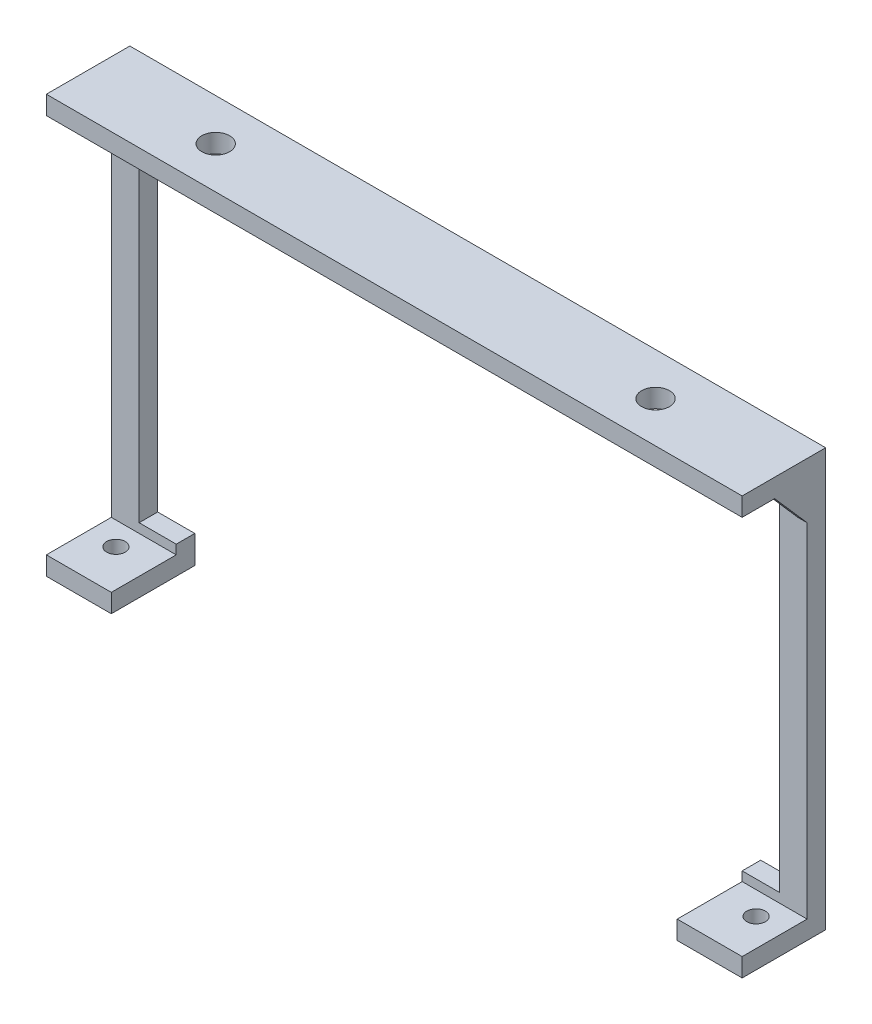
ISO-10303-21;
HEADER;
FILE_DESCRIPTION(('STEP AP214'),'2;1');
FILE_NAME('part.step','',(''),(''),'','','');
FILE_SCHEMA(('AUTOMOTIVE_DESIGN { 1 0 10303 214 1 1 1 1 }'));
ENDSEC;
DATA;
#1=APPLICATION_CONTEXT('core data for automotive mechanical design processes');
#2=APPLICATION_PROTOCOL_DEFINITION('international standard','automotive_design',2000,#1);
#3=PRODUCT_CONTEXT('',#1,'mechanical');
#4=PRODUCT('Part','Part','',(#3));
#5=PRODUCT_RELATED_PRODUCT_CATEGORY('part','',(#4));
#6=PRODUCT_DEFINITION_FORMATION('','',#4);
#7=PRODUCT_DEFINITION_CONTEXT('part definition',#1,'design');
#8=PRODUCT_DEFINITION('design','',#6,#7);
#9=PRODUCT_DEFINITION_SHAPE('','',#8);
#10=(LENGTH_UNIT() NAMED_UNIT(*) SI_UNIT(.MILLI.,.METRE.));
#11=(NAMED_UNIT(*) PLANE_ANGLE_UNIT() SI_UNIT($,.RADIAN.));
#12=(NAMED_UNIT(*) SI_UNIT($,.STERADIAN.) SOLID_ANGLE_UNIT());
#13=UNCERTAINTY_MEASURE_WITH_UNIT(LENGTH_MEASURE(1.E-05),#10,'distance_accuracy_value','');
#14=(GEOMETRIC_REPRESENTATION_CONTEXT(3) GLOBAL_UNCERTAINTY_ASSIGNED_CONTEXT((#13)) GLOBAL_UNIT_ASSIGNED_CONTEXT((#10,
#11,#12)) REPRESENTATION_CONTEXT('',''));
#15=CARTESIAN_POINT('',(0.,0.,0.));
#16=DIRECTION('',(0.,0.,1.));
#17=DIRECTION('',(1.,0.,0.));
#18=AXIS2_PLACEMENT_3D('',#15,#16,#17);
#19=CARTESIAN_POINT('',(68.,0.,2.));
#20=DIRECTION('',(0.,1.,0.));
#21=DIRECTION('',(0.,0.,1.));
#22=AXIS2_PLACEMENT_3D('',#19,#20,#21);
#23=PLANE('',#22);
#24=CARTESIAN_POINT('',(72.,0.,4.5));
#25=DIRECTION('',(0.,-1.,0.));
#26=DIRECTION('',(0.,0.,-1.));
#27=AXIS2_PLACEMENT_3D('',#24,#25,#26);
#28=CIRCLE('',#27,0.999999999999998);
#29=CARTESIAN_POINT('',(72.,0.,3.50000000000001));
#30=VERTEX_POINT('',#29);
#31=EDGE_CURVE('E391',#30,#30,#28,.T.);
#32=ORIENTED_EDGE('',*,*,#31,.F.);
#33=EDGE_LOOP('',(#32));
#34=FACE_BOUND('',#33,.T.);
#35=DIRECTION('',(-1.,0.,0.));
#36=VECTOR('',#35,1.);
#37=CARTESIAN_POINT('',(82.2801098892805,0.,9.));
#38=LINE('',#37,#36);
#39=CARTESIAN_POINT('',(75.,0.,9.));
#40=VERTEX_POINT('',#39);
#41=CARTESIAN_POINT('',(68.,0.,9.00000000000013));
#42=VERTEX_POINT('',#41);
#43=EDGE_CURVE('E201',#40,#42,#38,.T.);
#44=ORIENTED_EDGE('',*,*,#43,.T.);
#45=DIRECTION('',(0.,0.,-1.));
#46=VECTOR('',#45,1.);
#47=CARTESIAN_POINT('',(68.,0.,2.));
#48=LINE('',#47,#46);
#49=CARTESIAN_POINT('',(68.,0.,0.));
#50=VERTEX_POINT('',#49);
#51=EDGE_CURVE('E185',#42,#50,#48,.T.);
#52=ORIENTED_EDGE('',*,*,#51,.T.);
#53=DIRECTION('',(1.,0.,0.));
#54=VECTOR('',#53,1.);
#55=CARTESIAN_POINT('',(68.,0.,0.));
#56=LINE('',#55,#54);
#57=CARTESIAN_POINT('',(75.,0.,0.));
#58=VERTEX_POINT('',#57);
#59=EDGE_CURVE('E297',#50,#58,#56,.T.);
#60=ORIENTED_EDGE('',*,*,#59,.T.);
#61=DIRECTION('',(0.,0.,-1.));
#62=VECTOR('',#61,1.);
#63=CARTESIAN_POINT('',(75.,0.,2.));
#64=LINE('',#63,#62);
#65=EDGE_CURVE('E194',#40,#58,#64,.T.);
#66=ORIENTED_EDGE('',*,*,#65,.F.);
#67=EDGE_LOOP('',(#44,#52,#60,#66));
#68=FACE_BOUND('',#67,.T.);
#69=ADVANCED_FACE('F35',(#34,#68),#23,.F.);
#70=CARTESIAN_POINT('',(82.2801098892805,0.,9.));
#71=DIRECTION('',(0.,0.,-1.));
#72=DIRECTION('',(-1.,0.,0.));
#73=AXIS2_PLACEMENT_3D('',#70,#71,#72);
#74=PLANE('',#73);
#75=DIRECTION('',(-1.,0.,0.));
#76=VECTOR('',#75,1.);
#77=CARTESIAN_POINT('',(82.2801098892805,2.,9.));
#78=LINE('',#77,#76);
#79=CARTESIAN_POINT('',(75.,2.,9.));
#80=VERTEX_POINT('',#79);
#81=CARTESIAN_POINT('',(68.,2.,9.));
#82=VERTEX_POINT('',#81);
#83=EDGE_CURVE('E203',#80,#82,#78,.T.);
#84=ORIENTED_EDGE('',*,*,#83,.T.);
#85=DIRECTION('',(0.,-1.,0.));
#86=VECTOR('',#85,1.);
#87=CARTESIAN_POINT('',(68.,2.00000000000002,9.00000000000012));
#88=LINE('',#87,#86);
#89=EDGE_CURVE('E53',#82,#42,#88,.T.);
#90=ORIENTED_EDGE('',*,*,#89,.T.);
#91=ORIENTED_EDGE('',*,*,#43,.F.);
#92=DIRECTION('',(0.,1.,0.));
#93=VECTOR('',#92,1.);
#94=CARTESIAN_POINT('',(75.,0.,9.));
#95=LINE('',#94,#93);
#96=EDGE_CURVE('E219',#40,#80,#95,.T.);
#97=ORIENTED_EDGE('',*,*,#96,.T.);
#98=EDGE_LOOP('',(#84,#90,#91,#97));
#99=FACE_BOUND('',#98,.T.);
#100=ADVANCED_FACE('F199',(#99),#74,.F.);
#101=CARTESIAN_POINT('',(82.2801098892805,2.,1.99999999999999));
#102=DIRECTION('',(0.,-1.,0.));
#103=DIRECTION('',(0.,0.,-1.));
#104=AXIS2_PLACEMENT_3D('',#101,#102,#103);
#105=PLANE('',#104);
#106=CARTESIAN_POINT('',(72.,2.,4.5));
#107=DIRECTION('',(0.,-1.,0.));
#108=DIRECTION('',(0.,0.,-1.));
#109=AXIS2_PLACEMENT_3D('',#106,#107,#108);
#110=CIRCLE('',#109,0.999999999999998);
#111=CARTESIAN_POINT('',(72.,2.,3.50000000000001));
#112=VERTEX_POINT('',#111);
#113=EDGE_CURVE('E394',#112,#112,#110,.F.);
#114=ORIENTED_EDGE('',*,*,#113,.F.);
#115=EDGE_LOOP('',(#114));
#116=FACE_BOUND('',#115,.T.);
#117=DIRECTION('',(-1.,0.,0.));
#118=VECTOR('',#117,1.);
#119=CARTESIAN_POINT('',(82.2801098892805,2.,1.99999999999999));
#120=LINE('',#119,#118);
#121=CARTESIAN_POINT('',(75.,2.,1.99999999999999));
#122=VERTEX_POINT('',#121);
#123=CARTESIAN_POINT('',(68.,2.,1.99999999999999));
#124=VERTEX_POINT('',#123);
#125=EDGE_CURVE('E216',#122,#124,#120,.T.);
#126=ORIENTED_EDGE('',*,*,#125,.T.);
#127=DIRECTION('',(0.,0.,-1.));
#128=VECTOR('',#127,1.);
#129=CARTESIAN_POINT('',(68.,2.00000000000002,9.00000000000012));
#130=LINE('',#129,#128);
#131=EDGE_CURVE('E397',#82,#124,#130,.T.);
#132=ORIENTED_EDGE('',*,*,#131,.F.);
#133=ORIENTED_EDGE('',*,*,#83,.F.);
#134=DIRECTION('',(0.,0.,-1.));
#135=VECTOR('',#134,1.);
#136=CARTESIAN_POINT('',(75.,2.,1.99999999999999));
#137=LINE('',#136,#135);
#138=EDGE_CURVE('E228',#80,#122,#137,.T.);
#139=ORIENTED_EDGE('',*,*,#138,.T.);
#140=EDGE_LOOP('',(#126,#132,#133,#139));
#141=FACE_BOUND('',#140,.T.);
#142=ADVANCED_FACE('F407',(#116,#141),#105,.F.);
#143=CARTESIAN_POINT('',(0.,45.,2.));
#144=DIRECTION('',(0.,0.,-1.));
#145=DIRECTION('',(-1.,0.,0.));
#146=AXIS2_PLACEMENT_3D('',#143,#144,#145);
#147=PLANE('',#146);
#148=DIRECTION('',(1.,0.,0.));
#149=VECTOR('',#148,1.);
#150=CARTESIAN_POINT('',(74.,39.,2.));
#151=LINE('',#150,#149);
#152=CARTESIAN_POINT('',(74.,39.,2.));
#153=VERTEX_POINT('',#152);
#154=CARTESIAN_POINT('',(75.,39.,2.));
#155=VERTEX_POINT('',#154);
#156=EDGE_CURVE('E61',#153,#155,#151,.T.);
#157=ORIENTED_EDGE('',*,*,#156,.F.);
#158=DIRECTION('',(0.,-1.,0.));
#159=VECTOR('',#158,1.);
#160=CARTESIAN_POINT('',(74.,43.,2.));
#161=LINE('',#160,#159);
#162=CARTESIAN_POINT('',(74.,43.,2.));
#163=VERTEX_POINT('',#162);
#164=EDGE_CURVE('E361',#163,#153,#161,.T.);
#165=ORIENTED_EDGE('',*,*,#164,.F.);
#166=DIRECTION('',(-1.,0.,0.));
#167=VECTOR('',#166,1.);
#168=CARTESIAN_POINT('',(82.2801098892805,43.,2.));
#169=LINE('',#168,#167);
#170=CARTESIAN_POINT('',(1.,43.,2.));
#171=VERTEX_POINT('',#170);
#172=EDGE_CURVE('E233',#163,#171,#169,.T.);
#173=ORIENTED_EDGE('',*,*,#172,.T.);
#174=DIRECTION('',(0.,-1.,0.));
#175=VECTOR('',#174,1.);
#176=CARTESIAN_POINT('',(1.,43.,2.));
#177=LINE('',#176,#175);
#178=CARTESIAN_POINT('',(1.,39.,2.));
#179=VERTEX_POINT('',#178);
#180=EDGE_CURVE('E354',#171,#179,#177,.T.);
#181=ORIENTED_EDGE('',*,*,#180,.T.);
#182=DIRECTION('',(-1.,0.,0.));
#183=VECTOR('',#182,1.);
#184=CARTESIAN_POINT('',(1.,39.,2.));
#185=LINE('',#184,#183);
#186=CARTESIAN_POINT('',(0.,39.,2.));
#187=VERTEX_POINT('',#186);
#188=EDGE_CURVE('E340',#179,#187,#185,.T.);
#189=ORIENTED_EDGE('',*,*,#188,.T.);
#190=DIRECTION('',(0.,-1.,0.));
#191=VECTOR('',#190,1.);
#192=CARTESIAN_POINT('',(0.,0.,2.));
#193=LINE('',#192,#191);
#194=CARTESIAN_POINT('',(0.,2.,1.99999999999999));
#195=VERTEX_POINT('',#194);
#196=EDGE_CURVE('E235',#187,#195,#193,.T.);
#197=ORIENTED_EDGE('',*,*,#196,.T.);
#198=DIRECTION('',(-1.,0.,0.));
#199=VECTOR('',#198,1.);
#200=CARTESIAN_POINT('',(0.,2.,2.));
#201=LINE('',#200,#199);
#202=CARTESIAN_POINT('',(7.,2.,2.));
#203=VERTEX_POINT('',#202);
#204=EDGE_CURVE('E11',#203,#195,#201,.T.);
#205=ORIENTED_EDGE('',*,*,#204,.F.);
#206=DIRECTION('',(0.,1.,0.));
#207=VECTOR('',#206,1.);
#208=CARTESIAN_POINT('',(7.,3.,2.));
#209=LINE('',#208,#207);
#210=CARTESIAN_POINT('',(7.,3.,2.));
#211=VERTEX_POINT('',#210);
#212=EDGE_CURVE('E237',#203,#211,#209,.T.);
#213=ORIENTED_EDGE('',*,*,#212,.T.);
#214=DIRECTION('',(-1.,0.,0.));
#215=VECTOR('',#214,1.);
#216=CARTESIAN_POINT('',(3.,3.,2.));
#217=LINE('',#216,#215);
#218=CARTESIAN_POINT('',(3.,3.,2.));
#219=VERTEX_POINT('',#218);
#220=EDGE_CURVE('E244',#211,#219,#217,.T.);
#221=ORIENTED_EDGE('',*,*,#220,.T.);
#222=DIRECTION('',(0.,1.,0.));
#223=VECTOR('',#222,1.);
#224=CARTESIAN_POINT('',(3.,3.,2.));
#225=LINE('',#224,#223);
#226=CARTESIAN_POINT('',(3.,42.,2.));
#227=VERTEX_POINT('',#226);
#228=EDGE_CURVE('E246',#219,#227,#225,.T.);
#229=ORIENTED_EDGE('',*,*,#228,.T.);
#230=DIRECTION('',(1.,0.,0.));
#231=VECTOR('',#230,1.);
#232=CARTESIAN_POINT('',(3.,42.,2.));
#233=LINE('',#232,#231);
#234=CARTESIAN_POINT('',(72.,42.,2.));
#235=VERTEX_POINT('',#234);
#236=EDGE_CURVE('E248',#227,#235,#233,.T.);
#237=ORIENTED_EDGE('',*,*,#236,.T.);
#238=DIRECTION('',(0.,-1.,0.));
#239=VECTOR('',#238,1.);
#240=CARTESIAN_POINT('',(72.,3.,2.));
#241=LINE('',#240,#239);
#242=CARTESIAN_POINT('',(72.,3.,2.));
#243=VERTEX_POINT('',#242);
#244=EDGE_CURVE('E250',#235,#243,#241,.T.);
#245=ORIENTED_EDGE('',*,*,#244,.T.);
#246=DIRECTION('',(-1.,0.,0.));
#247=VECTOR('',#246,1.);
#248=CARTESIAN_POINT('',(68.,3.,2.));
#249=LINE('',#248,#247);
#250=CARTESIAN_POINT('',(68.,3.,2.));
#251=VERTEX_POINT('',#250);
#252=EDGE_CURVE('E252',#243,#251,#249,.T.);
#253=ORIENTED_EDGE('',*,*,#252,.T.);
#254=DIRECTION('',(0.,-1.,0.));
#255=VECTOR('',#254,1.);
#256=CARTESIAN_POINT('',(68.,3.,2.));
#257=LINE('',#256,#255);
#258=EDGE_CURVE('E254',#251,#124,#257,.T.);
#259=ORIENTED_EDGE('',*,*,#258,.T.);
#260=ORIENTED_EDGE('',*,*,#125,.F.);
#261=DIRECTION('',(0.,1.,0.));
#262=VECTOR('',#261,1.);
#263=CARTESIAN_POINT('',(75.,0.,2.));
#264=LINE('',#263,#262);
#265=EDGE_CURVE('E257',#122,#155,#264,.T.);
#266=ORIENTED_EDGE('',*,*,#265,.T.);
#267=EDGE_LOOP('',(#157,#165,#173,#181,#189,#197,#205,#213,#221,#229,#237,#245,#253,#259,#260,#266));
#268=FACE_BOUND('',#267,.T.);
#269=ADVANCED_FACE('F404',(#268),#147,.F.);
#270=CARTESIAN_POINT('',(82.2801098892805,43.,2.));
#271=DIRECTION('',(0.,1.,0.));
#272=DIRECTION('',(0.,0.,1.));
#273=AXIS2_PLACEMENT_3D('',#270,#271,#272);
#274=PLANE('',#273);
#275=CARTESIAN_POINT('',(61.24995606913,43.,4.58596982128615));
#276=DIRECTION('',(0.,1.,0.));
#277=DIRECTION('',(0.,0.,1.));
#278=AXIS2_PLACEMENT_3D('',#275,#276,#277);
#279=CIRCLE('',#278,1.5);
#280=CARTESIAN_POINT('',(61.24995606913,43.,6.08596982128615));
#281=VERTEX_POINT('',#280);
#282=EDGE_CURVE('E377',#281,#281,#279,.F.);
#283=ORIENTED_EDGE('',*,*,#282,.F.);
#284=EDGE_LOOP('',(#283));
#285=FACE_BOUND('',#284,.T.);
#286=CARTESIAN_POINT('',(13.75004393087,43.,4.4946086830809));
#287=DIRECTION('',(0.,1.,0.));
#288=DIRECTION('',(0.,0.,1.));
#289=AXIS2_PLACEMENT_3D('',#286,#287,#288);
#290=CIRCLE('',#289,1.5);
#291=CARTESIAN_POINT('',(13.75004393087,43.,5.9946086830809));
#292=VERTEX_POINT('',#291);
#293=EDGE_CURVE('E367',#292,#292,#290,.F.);
#294=ORIENTED_EDGE('',*,*,#293,.F.);
#295=EDGE_LOOP('',(#294));
#296=FACE_BOUND('',#295,.T.);
#297=DIRECTION('',(1.,0.,0.));
#298=VECTOR('',#297,1.);
#299=CARTESIAN_POINT('',(74.,43.,5.5));
#300=LINE('',#299,#298);
#301=CARTESIAN_POINT('',(74.,43.,5.5));
#302=VERTEX_POINT('',#301);
#303=CARTESIAN_POINT('',(75.,43.,5.5));
#304=VERTEX_POINT('',#303);
#305=EDGE_CURVE('E358',#302,#304,#300,.T.);
#306=ORIENTED_EDGE('',*,*,#305,.T.);
#307=DIRECTION('',(0.,0.,1.));
#308=VECTOR('',#307,1.);
#309=CARTESIAN_POINT('',(75.,43.,2.));
#310=LINE('',#309,#308);
#311=CARTESIAN_POINT('',(75.,43.,9.));
#312=VERTEX_POINT('',#311);
#313=EDGE_CURVE('E39',#304,#312,#310,.T.);
#314=ORIENTED_EDGE('',*,*,#313,.T.);
#315=DIRECTION('',(-1.,0.,0.));
#316=VECTOR('',#315,1.);
#317=CARTESIAN_POINT('',(82.2801098892805,43.,9.));
#318=LINE('',#317,#316);
#319=CARTESIAN_POINT('',(0.,43.,9.));
#320=VERTEX_POINT('',#319);
#321=EDGE_CURVE('E231',#312,#320,#318,.T.);
#322=ORIENTED_EDGE('',*,*,#321,.T.);
#323=DIRECTION('',(0.,0.,-1.));
#324=VECTOR('',#323,1.);
#325=CARTESIAN_POINT('',(0.,43.,2.));
#326=LINE('',#325,#324);
#327=CARTESIAN_POINT('',(0.,43.,5.5));
#328=VERTEX_POINT('',#327);
#329=EDGE_CURVE('E227',#320,#328,#326,.T.);
#330=ORIENTED_EDGE('',*,*,#329,.T.);
#331=DIRECTION('',(-1.,0.,0.));
#332=VECTOR('',#331,1.);
#333=CARTESIAN_POINT('',(1.,43.,5.5));
#334=LINE('',#333,#332);
#335=CARTESIAN_POINT('',(1.,43.,5.5));
#336=VERTEX_POINT('',#335);
#337=EDGE_CURVE('E337',#336,#328,#334,.T.);
#338=ORIENTED_EDGE('',*,*,#337,.F.);
#339=DIRECTION('',(0.,0.,-1.));
#340=VECTOR('',#339,1.);
#341=CARTESIAN_POINT('',(1.,43.,5.5));
#342=LINE('',#341,#340);
#343=EDGE_CURVE('E351',#336,#171,#342,.T.);
#344=ORIENTED_EDGE('',*,*,#343,.T.);
#345=ORIENTED_EDGE('',*,*,#172,.F.);
#346=DIRECTION('',(0.,0.,-1.));
#347=VECTOR('',#346,1.);
#348=CARTESIAN_POINT('',(74.,43.,5.5));
#349=LINE('',#348,#347);
#350=EDGE_CURVE('E366',#302,#163,#349,.T.);
#351=ORIENTED_EDGE('',*,*,#350,.F.);
#352=EDGE_LOOP('',(#306,#314,#322,#330,#338,#344,#345,#351));
#353=FACE_BOUND('',#352,.T.);
#354=ADVANCED_FACE('F419',(#285,#296,#353),#274,.F.);
#355=CARTESIAN_POINT('',(0.,0.,2.));
#356=DIRECTION('',(1.,0.,0.));
#357=DIRECTION('',(0.,0.,-1.));
#358=AXIS2_PLACEMENT_3D('',#355,#356,#357);
#359=PLANE('',#358);
#360=ORIENTED_EDGE('',*,*,#196,.F.);
#361=DIRECTION('',(0.,0.752576694706877,0.658504607868519));
#362=VECTOR('',#361,1.);
#363=CARTESIAN_POINT('',(0.,43.,5.5));
#364=LINE('',#363,#362);
#365=EDGE_CURVE('E348',#187,#328,#364,.T.);
#366=ORIENTED_EDGE('',*,*,#365,.T.);
#367=ORIENTED_EDGE('',*,*,#329,.F.);
#368=DIRECTION('',(0.,-1.,0.));
#369=VECTOR('',#368,1.);
#370=CARTESIAN_POINT('',(0.,45.,9.));
#371=LINE('',#370,#369);
#372=CARTESIAN_POINT('',(0.,45.,9.));
#373=VERTEX_POINT('',#372);
#374=EDGE_CURVE('E224',#373,#320,#371,.T.);
#375=ORIENTED_EDGE('',*,*,#374,.F.);
#376=DIRECTION('',(0.,0.,-1.));
#377=VECTOR('',#376,1.);
#378=CARTESIAN_POINT('',(0.,45.,2.));
#379=LINE('',#378,#377);
#380=CARTESIAN_POINT('',(0.,45.,0.));
#381=VERTEX_POINT('',#380);
#382=EDGE_CURVE('E261',#373,#381,#379,.T.);
#383=ORIENTED_EDGE('',*,*,#382,.T.);
#384=DIRECTION('',(0.,-1.,0.));
#385=VECTOR('',#384,1.);
#386=CARTESIAN_POINT('',(0.,0.,0.));
#387=LINE('',#386,#385);
#388=CARTESIAN_POINT('',(0.,0.,0.));
#389=VERTEX_POINT('',#388);
#390=EDGE_CURVE('E223',#381,#389,#387,.T.);
#391=ORIENTED_EDGE('',*,*,#390,.T.);
#392=DIRECTION('',(0.,0.,-1.));
#393=VECTOR('',#392,1.);
#394=CARTESIAN_POINT('',(0.,0.,2.));
#395=LINE('',#394,#393);
#396=CARTESIAN_POINT('',(0.,0.,9.));
#397=VERTEX_POINT('',#396);
#398=EDGE_CURVE('E45',#397,#389,#395,.T.);
#399=ORIENTED_EDGE('',*,*,#398,.F.);
#400=DIRECTION('',(0.,-1.,0.));
#401=VECTOR('',#400,1.);
#402=CARTESIAN_POINT('',(0.,0.,9.));
#403=LINE('',#402,#401);
#404=CARTESIAN_POINT('',(0.,2.,9.));
#405=VERTEX_POINT('',#404);
#406=EDGE_CURVE('E212',#405,#397,#403,.T.);
#407=ORIENTED_EDGE('',*,*,#406,.F.);
#408=DIRECTION('',(0.,0.,1.));
#409=VECTOR('',#408,1.);
#410=CARTESIAN_POINT('',(0.,2.,1.99999999999999));
#411=LINE('',#410,#409);
#412=EDGE_CURVE('E336',#195,#405,#411,.T.);
#413=ORIENTED_EDGE('',*,*,#412,.F.);
#414=EDGE_LOOP('',(#360,#366,#367,#375,#383,#391,#399,#407,#413));
#415=FACE_BOUND('',#414,.T.);
#416=ADVANCED_FACE('F37',(#415),#359,.F.);
#417=CARTESIAN_POINT('',(7.,3.,2.));
#418=DIRECTION('',(-1.,0.,0.));
#419=DIRECTION('',(0.,0.,1.));
#420=AXIS2_PLACEMENT_3D('',#417,#418,#419);
#421=PLANE('',#420);
#422=DIRECTION('',(0.,1.,0.));
#423=VECTOR('',#422,1.);
#424=CARTESIAN_POINT('',(7.,3.,0.));
#425=LINE('',#424,#423);
#426=CARTESIAN_POINT('',(7.,0.,0.));
#427=VERTEX_POINT('',#426);
#428=CARTESIAN_POINT('',(7.,3.,0.));
#429=VERTEX_POINT('',#428);
#430=EDGE_CURVE('E310',#427,#429,#425,.T.);
#431=ORIENTED_EDGE('',*,*,#430,.T.);
#432=DIRECTION('',(0.,0.,-1.));
#433=VECTOR('',#432,1.);
#434=CARTESIAN_POINT('',(7.,3.,2.));
#435=LINE('',#434,#433);
#436=EDGE_CURVE('E272',#211,#429,#435,.T.);
#437=ORIENTED_EDGE('',*,*,#436,.F.);
#438=ORIENTED_EDGE('',*,*,#212,.F.);
#439=DIRECTION('',(0.,0.,-1.));
#440=VECTOR('',#439,1.);
#441=CARTESIAN_POINT('',(7.,2.00000000000002,9.00000000000012));
#442=LINE('',#441,#440);
#443=CARTESIAN_POINT('',(7.,2.00000000000002,9.00000000000012));
#444=VERTEX_POINT('',#443);
#445=EDGE_CURVE('E398',#444,#203,#442,.T.);
#446=ORIENTED_EDGE('',*,*,#445,.F.);
#447=DIRECTION('',(0.,1.,0.));
#448=VECTOR('',#447,1.);
#449=CARTESIAN_POINT('',(7.,0.,9.00000000000013));
#450=LINE('',#449,#448);
#451=CARTESIAN_POINT('',(7.,0.,9.00000000000013));
#452=VERTEX_POINT('',#451);
#453=EDGE_CURVE('E204',#452,#444,#450,.T.);
#454=ORIENTED_EDGE('',*,*,#453,.F.);
#455=DIRECTION('',(0.,0.,-1.));
#456=VECTOR('',#455,1.);
#457=CARTESIAN_POINT('',(7.,0.,2.));
#458=LINE('',#457,#456);
#459=EDGE_CURVE('E269',#452,#427,#458,.T.);
#460=ORIENTED_EDGE('',*,*,#459,.T.);
#461=EDGE_LOOP('',(#431,#437,#438,#446,#454,#460));
#462=FACE_BOUND('',#461,.T.);
#463=ADVANCED_FACE('F434',(#462),#421,.F.);
#464=CARTESIAN_POINT('',(3.,3.,2.));
#465=DIRECTION('',(0.,-1.,0.));
#466=DIRECTION('',(0.,0.,-1.));
#467=AXIS2_PLACEMENT_3D('',#464,#465,#466);
#468=PLANE('',#467);
#469=DIRECTION('',(-1.,0.,0.));
#470=VECTOR('',#469,1.);
#471=CARTESIAN_POINT('',(3.,3.,0.));
#472=LINE('',#471,#470);
#473=CARTESIAN_POINT('',(3.,3.,0.));
#474=VERTEX_POINT('',#473);
#475=EDGE_CURVE('E308',#429,#474,#472,.T.);
#476=ORIENTED_EDGE('',*,*,#475,.T.);
#477=DIRECTION('',(0.,0.,-1.));
#478=VECTOR('',#477,1.);
#479=CARTESIAN_POINT('',(3.,3.,2.));
#480=LINE('',#479,#478);
#481=EDGE_CURVE('E275',#219,#474,#480,.T.);
#482=ORIENTED_EDGE('',*,*,#481,.F.);
#483=ORIENTED_EDGE('',*,*,#220,.F.);
#484=ORIENTED_EDGE('',*,*,#436,.T.);
#485=EDGE_LOOP('',(#476,#482,#483,#484));
#486=FACE_BOUND('',#485,.T.);
#487=ADVANCED_FACE('F441',(#486),#468,.F.);
#488=CARTESIAN_POINT('',(3.,3.,2.));
#489=DIRECTION('',(-1.,0.,0.));
#490=DIRECTION('',(0.,0.,1.));
#491=AXIS2_PLACEMENT_3D('',#488,#489,#490);
#492=PLANE('',#491);
#493=DIRECTION('',(0.,1.,0.));
#494=VECTOR('',#493,1.);
#495=CARTESIAN_POINT('',(3.,3.,0.));
#496=LINE('',#495,#494);
#497=CARTESIAN_POINT('',(3.,42.,0.));
#498=VERTEX_POINT('',#497);
#499=EDGE_CURVE('E306',#474,#498,#496,.T.);
#500=ORIENTED_EDGE('',*,*,#499,.T.);
#501=DIRECTION('',(0.,0.,-1.));
#502=VECTOR('',#501,1.);
#503=CARTESIAN_POINT('',(3.,42.,2.));
#504=LINE('',#503,#502);
#505=EDGE_CURVE('E278',#227,#498,#504,.T.);
#506=ORIENTED_EDGE('',*,*,#505,.F.);
#507=ORIENTED_EDGE('',*,*,#228,.F.);
#508=ORIENTED_EDGE('',*,*,#481,.T.);
#509=EDGE_LOOP('',(#500,#506,#507,#508));
#510=FACE_BOUND('',#509,.T.);
#511=ADVANCED_FACE('F444',(#510),#492,.F.);
#512=CARTESIAN_POINT('',(3.,42.,2.));
#513=DIRECTION('',(0.,1.,0.));
#514=DIRECTION('',(0.,0.,1.));
#515=AXIS2_PLACEMENT_3D('',#512,#513,#514);
#516=PLANE('',#515);
#517=DIRECTION('',(1.,0.,0.));
#518=VECTOR('',#517,1.);
#519=CARTESIAN_POINT('',(3.,42.,0.));
#520=LINE('',#519,#518);
#521=CARTESIAN_POINT('',(72.,42.,0.));
#522=VERTEX_POINT('',#521);
#523=EDGE_CURVE('E304',#498,#522,#520,.T.);
#524=ORIENTED_EDGE('',*,*,#523,.T.);
#525=DIRECTION('',(0.,0.,-1.));
#526=VECTOR('',#525,1.);
#527=CARTESIAN_POINT('',(72.,42.,2.));
#528=LINE('',#527,#526);
#529=EDGE_CURVE('E281',#235,#522,#528,.T.);
#530=ORIENTED_EDGE('',*,*,#529,.F.);
#531=ORIENTED_EDGE('',*,*,#236,.F.);
#532=ORIENTED_EDGE('',*,*,#505,.T.);
#533=EDGE_LOOP('',(#524,#530,#531,#532));
#534=FACE_BOUND('',#533,.T.);
#535=ADVANCED_FACE('F449',(#534),#516,.F.);
#536=CARTESIAN_POINT('',(72.,3.,2.));
#537=DIRECTION('',(1.,0.,0.));
#538=DIRECTION('',(0.,0.,-1.));
#539=AXIS2_PLACEMENT_3D('',#536,#537,#538);
#540=PLANE('',#539);
#541=DIRECTION('',(0.,-1.,0.));
#542=VECTOR('',#541,1.);
#543=CARTESIAN_POINT('',(72.,3.,0.));
#544=LINE('',#543,#542);
#545=CARTESIAN_POINT('',(72.,3.,0.));
#546=VERTEX_POINT('',#545);
#547=EDGE_CURVE('E302',#522,#546,#544,.T.);
#548=ORIENTED_EDGE('',*,*,#547,.T.);
#549=DIRECTION('',(0.,0.,-1.));
#550=VECTOR('',#549,1.);
#551=CARTESIAN_POINT('',(72.,3.,2.));
#552=LINE('',#551,#550);
#553=EDGE_CURVE('E284',#243,#546,#552,.T.);
#554=ORIENTED_EDGE('',*,*,#553,.F.);
#555=ORIENTED_EDGE('',*,*,#244,.F.);
#556=ORIENTED_EDGE('',*,*,#529,.T.);
#557=EDGE_LOOP('',(#548,#554,#555,#556));
#558=FACE_BOUND('',#557,.T.);
#559=ADVANCED_FACE('F453',(#558),#540,.F.);
#560=CARTESIAN_POINT('',(68.,3.,2.));
#561=DIRECTION('',(0.,-1.,0.));
#562=DIRECTION('',(0.,0.,-1.));
#563=AXIS2_PLACEMENT_3D('',#560,#561,#562);
#564=PLANE('',#563);
#565=DIRECTION('',(-1.,0.,0.));
#566=VECTOR('',#565,1.);
#567=CARTESIAN_POINT('',(68.,3.,0.));
#568=LINE('',#567,#566);
#569=CARTESIAN_POINT('',(68.,3.,0.));
#570=VERTEX_POINT('',#569);
#571=EDGE_CURVE('E300',#546,#570,#568,.T.);
#572=ORIENTED_EDGE('',*,*,#571,.T.);
#573=DIRECTION('',(0.,0.,-1.));
#574=VECTOR('',#573,1.);
#575=CARTESIAN_POINT('',(68.,3.,2.));
#576=LINE('',#575,#574);
#577=EDGE_CURVE('E193',#251,#570,#576,.T.);
#578=ORIENTED_EDGE('',*,*,#577,.F.);
#579=ORIENTED_EDGE('',*,*,#252,.F.);
#580=ORIENTED_EDGE('',*,*,#553,.T.);
#581=EDGE_LOOP('',(#572,#578,#579,#580));
#582=FACE_BOUND('',#581,.T.);
#583=ADVANCED_FACE('F457',(#582),#564,.F.);
#584=CARTESIAN_POINT('',(68.,3.,2.));
#585=DIRECTION('',(1.,0.,0.));
#586=DIRECTION('',(0.,0.,-1.));
#587=AXIS2_PLACEMENT_3D('',#584,#585,#586);
#588=PLANE('',#587);
#589=DIRECTION('',(0.,-1.,0.));
#590=VECTOR('',#589,1.);
#591=CARTESIAN_POINT('',(68.,3.,0.));
#592=LINE('',#591,#590);
#593=EDGE_CURVE('E189',#570,#50,#592,.T.);
#594=ORIENTED_EDGE('',*,*,#593,.T.);
#595=ORIENTED_EDGE('',*,*,#51,.F.);
#596=ORIENTED_EDGE('',*,*,#89,.F.);
#597=ORIENTED_EDGE('',*,*,#131,.T.);
#598=ORIENTED_EDGE('',*,*,#258,.F.);
#599=ORIENTED_EDGE('',*,*,#577,.T.);
#600=EDGE_LOOP('',(#594,#595,#596,#597,#598,#599));
#601=FACE_BOUND('',#600,.T.);
#602=ADVANCED_FACE('F186',(#601),#588,.F.);
#603=CARTESIAN_POINT('',(3.,0.,4.49999999999999));
#604=DIRECTION('',(0.,-1.,0.));
#605=DIRECTION('',(0.,0.,-1.));
#606=AXIS2_PLACEMENT_3D('',#603,#604,#605);
#607=CIRCLE('',#606,1.);
#608=CARTESIAN_POINT('',(3.,0.,3.49999999999999));
#609=VERTEX_POINT('',#608);
#610=EDGE_CURVE('E383',#609,#609,#607,.T.);
#611=ORIENTED_EDGE('',*,*,#610,.F.);
#612=EDGE_LOOP('',(#611));
#613=FACE_BOUND('',#612,.T.);
#614=ORIENTED_EDGE('',*,*,#459,.F.);
#615=EDGE_CURVE('E209',#452,#397,#38,.T.);
#616=ORIENTED_EDGE('',*,*,#615,.T.);
#617=ORIENTED_EDGE('',*,*,#398,.T.);
#618=DIRECTION('',(1.,0.,0.));
#619=VECTOR('',#618,1.);
#620=CARTESIAN_POINT('',(0.,0.,0.));
#621=LINE('',#620,#619);
#622=EDGE_CURVE('E311',#389,#427,#621,.T.);
#623=ORIENTED_EDGE('',*,*,#622,.T.);
#624=EDGE_LOOP('',(#614,#616,#617,#623));
#625=FACE_BOUND('',#624,.T.);
#626=ADVANCED_FACE('F327',(#613,#625),#23,.F.);
#627=CARTESIAN_POINT('',(75.,0.,2.));
#628=DIRECTION('',(-1.,0.,0.));
#629=DIRECTION('',(0.,0.,1.));
#630=AXIS2_PLACEMENT_3D('',#627,#628,#629);
#631=PLANE('',#630);
#632=DIRECTION('',(0.,0.752576694706877,0.658504607868519));
#633=VECTOR('',#632,1.);
#634=CARTESIAN_POINT('',(75.,43.,5.5));
#635=LINE('',#634,#633);
#636=EDGE_CURVE('E363',#155,#304,#635,.T.);
#637=ORIENTED_EDGE('',*,*,#636,.F.);
#638=ORIENTED_EDGE('',*,*,#265,.F.);
#639=ORIENTED_EDGE('',*,*,#138,.F.);
#640=ORIENTED_EDGE('',*,*,#96,.F.);
#641=ORIENTED_EDGE('',*,*,#65,.T.);
#642=DIRECTION('',(0.,1.,0.));
#643=VECTOR('',#642,1.);
#644=CARTESIAN_POINT('',(75.,0.,0.));
#645=LINE('',#644,#643);
#646=CARTESIAN_POINT('',(75.,45.,0.));
#647=VERTEX_POINT('',#646);
#648=EDGE_CURVE('E295',#58,#647,#645,.T.);
#649=ORIENTED_EDGE('',*,*,#648,.T.);
#650=DIRECTION('',(0.,0.,-1.));
#651=VECTOR('',#650,1.);
#652=CARTESIAN_POINT('',(75.,45.,2.));
#653=LINE('',#652,#651);
#654=CARTESIAN_POINT('',(75.,45.,9.));
#655=VERTEX_POINT('',#654);
#656=EDGE_CURVE('E289',#655,#647,#653,.T.);
#657=ORIENTED_EDGE('',*,*,#656,.F.);
#658=DIRECTION('',(0.,1.,0.));
#659=VECTOR('',#658,1.);
#660=CARTESIAN_POINT('',(75.,45.,9.));
#661=LINE('',#660,#659);
#662=EDGE_CURVE('E220',#312,#655,#661,.T.);
#663=ORIENTED_EDGE('',*,*,#662,.F.);
#664=ORIENTED_EDGE('',*,*,#313,.F.);
#665=EDGE_LOOP('',(#637,#638,#639,#640,#641,#649,#657,#663,#664));
#666=FACE_BOUND('',#665,.T.);
#667=ADVANCED_FACE('F410',(#666),#631,.F.);
#668=CARTESIAN_POINT('',(0.,45.,2.));
#669=DIRECTION('',(0.,-1.,0.));
#670=DIRECTION('',(0.,0.,-1.));
#671=AXIS2_PLACEMENT_3D('',#668,#669,#670);
#672=PLANE('',#671);
#673=CARTESIAN_POINT('',(61.24995606913,45.,4.58596982128615));
#674=DIRECTION('',(0.,1.,0.));
#675=DIRECTION('',(0.,0.,1.));
#676=AXIS2_PLACEMENT_3D('',#673,#674,#675);
#677=CIRCLE('',#676,1.5);
#678=CARTESIAN_POINT('',(61.24995606913,45.,6.08596982128615));
#679=VERTEX_POINT('',#678);
#680=EDGE_CURVE('E380',#679,#679,#677,.T.);
#681=ORIENTED_EDGE('',*,*,#680,.F.);
#682=EDGE_LOOP('',(#681));
#683=FACE_BOUND('',#682,.T.);
#684=CARTESIAN_POINT('',(13.75004393087,45.,4.4946086830809));
#685=DIRECTION('',(0.,1.,0.));
#686=DIRECTION('',(0.,0.,1.));
#687=AXIS2_PLACEMENT_3D('',#684,#685,#686);
#688=CIRCLE('',#687,1.5);
#689=CARTESIAN_POINT('',(13.75004393087,45.,5.9946086830809));
#690=VERTEX_POINT('',#689);
#691=EDGE_CURVE('E374',#690,#690,#688,.T.);
#692=ORIENTED_EDGE('',*,*,#691,.F.);
#693=EDGE_LOOP('',(#692));
#694=FACE_BOUND('',#693,.T.);
#695=DIRECTION('',(-1.,0.,0.));
#696=VECTOR('',#695,1.);
#697=CARTESIAN_POINT('',(0.,45.,0.));
#698=LINE('',#697,#696);
#699=EDGE_CURVE('E238',#647,#381,#698,.T.);
#700=ORIENTED_EDGE('',*,*,#699,.T.);
#701=ORIENTED_EDGE('',*,*,#382,.F.);
#702=DIRECTION('',(-1.,0.,0.));
#703=VECTOR('',#702,1.);
#704=CARTESIAN_POINT('',(82.2801098892805,45.,9.));
#705=LINE('',#704,#703);
#706=EDGE_CURVE('E242',#655,#373,#705,.T.);
#707=ORIENTED_EDGE('',*,*,#706,.F.);
#708=ORIENTED_EDGE('',*,*,#656,.T.);
#709=EDGE_LOOP('',(#700,#701,#707,#708));
#710=FACE_BOUND('',#709,.T.);
#711=ADVANCED_FACE('F461',(#683,#694,#710),#672,.F.);
#712=CARTESIAN_POINT('',(0.,45.,0.));
#713=DIRECTION('',(0.,0.,-1.));
#714=DIRECTION('',(-1.,0.,0.));
#715=AXIS2_PLACEMENT_3D('',#712,#713,#714);
#716=PLANE('',#715);
#717=ORIENTED_EDGE('',*,*,#390,.F.);
#718=ORIENTED_EDGE('',*,*,#699,.F.);
#719=ORIENTED_EDGE('',*,*,#648,.F.);
#720=ORIENTED_EDGE('',*,*,#59,.F.);
#721=ORIENTED_EDGE('',*,*,#593,.F.);
#722=ORIENTED_EDGE('',*,*,#571,.F.);
#723=ORIENTED_EDGE('',*,*,#547,.F.);
#724=ORIENTED_EDGE('',*,*,#523,.F.);
#725=ORIENTED_EDGE('',*,*,#499,.F.);
#726=ORIENTED_EDGE('',*,*,#475,.F.);
#727=ORIENTED_EDGE('',*,*,#430,.F.);
#728=ORIENTED_EDGE('',*,*,#622,.F.);
#729=EDGE_LOOP('',(#717,#718,#719,#720,#721,#722,#723,#724,#725,#726,#727,#728));
#730=FACE_BOUND('',#729,.T.);
#731=ADVANCED_FACE('F323',(#730),#716,.T.);
#732=CARTESIAN_POINT('',(82.2801098892805,45.,9.));
#733=DIRECTION('',(0.,0.,-1.));
#734=DIRECTION('',(-1.,0.,0.));
#735=AXIS2_PLACEMENT_3D('',#732,#733,#734);
#736=PLANE('',#735);
#737=ORIENTED_EDGE('',*,*,#321,.F.);
#738=ORIENTED_EDGE('',*,*,#662,.T.);
#739=ORIENTED_EDGE('',*,*,#706,.T.);
#740=ORIENTED_EDGE('',*,*,#374,.T.);
#741=EDGE_LOOP('',(#737,#738,#739,#740));
#742=FACE_BOUND('',#741,.T.);
#743=ADVANCED_FACE('F465',(#742),#736,.F.);
#744=ORIENTED_EDGE('',*,*,#615,.F.);
#745=ORIENTED_EDGE('',*,*,#453,.T.);
#746=EDGE_CURVE('E208',#444,#405,#78,.T.);
#747=ORIENTED_EDGE('',*,*,#746,.T.);
#748=ORIENTED_EDGE('',*,*,#406,.T.);
#749=EDGE_LOOP('',(#744,#745,#747,#748));
#750=FACE_BOUND('',#749,.T.);
#751=ADVANCED_FACE('F332',(#750),#74,.F.);
#752=CARTESIAN_POINT('',(3.,2.,4.49999999999999));
#753=DIRECTION('',(0.,-1.,0.));
#754=DIRECTION('',(0.,0.,-1.));
#755=AXIS2_PLACEMENT_3D('',#752,#753,#754);
#756=CIRCLE('',#755,1.);
#757=CARTESIAN_POINT('',(3.,2.,3.49999999999999));
#758=VERTEX_POINT('',#757);
#759=EDGE_CURVE('E388',#758,#758,#756,.F.);
#760=ORIENTED_EDGE('',*,*,#759,.F.);
#761=EDGE_LOOP('',(#760));
#762=FACE_BOUND('',#761,.T.);
#763=ORIENTED_EDGE('',*,*,#746,.F.);
#764=ORIENTED_EDGE('',*,*,#445,.T.);
#765=ORIENTED_EDGE('',*,*,#204,.T.);
#766=ORIENTED_EDGE('',*,*,#412,.T.);
#767=EDGE_LOOP('',(#763,#764,#765,#766));
#768=FACE_BOUND('',#767,.T.);
#769=ADVANCED_FACE('F432',(#762,#768),#105,.F.);
#770=CARTESIAN_POINT('',(1.,43.,5.5));
#771=DIRECTION('',(0.,-0.658504607868519,0.752576694706877));
#772=DIRECTION('',(0.,-0.752576694706877,-0.658504607868519));
#773=AXIS2_PLACEMENT_3D('',#770,#771,#772);
#774=PLANE('',#773);
#775=ORIENTED_EDGE('',*,*,#365,.F.);
#776=ORIENTED_EDGE('',*,*,#188,.F.);
#777=DIRECTION('',(0.,0.752576694706877,0.658504607868519));
#778=VECTOR('',#777,1.);
#779=CARTESIAN_POINT('',(1.,43.,5.5));
#780=LINE('',#779,#778);
#781=EDGE_CURVE('E346',#179,#336,#780,.T.);
#782=ORIENTED_EDGE('',*,*,#781,.T.);
#783=ORIENTED_EDGE('',*,*,#337,.T.);
#784=EDGE_LOOP('',(#775,#776,#782,#783));
#785=FACE_BOUND('',#784,.T.);
#786=ADVANCED_FACE('F428',(#785),#774,.T.);
#787=CARTESIAN_POINT('',(1.,43.,2.));
#788=DIRECTION('',(-1.,0.,0.));
#789=DIRECTION('',(0.,0.,1.));
#790=AXIS2_PLACEMENT_3D('',#787,#788,#789);
#791=PLANE('',#790);
#792=ORIENTED_EDGE('',*,*,#343,.F.);
#793=ORIENTED_EDGE('',*,*,#781,.F.);
#794=ORIENTED_EDGE('',*,*,#180,.F.);
#795=EDGE_LOOP('',(#792,#793,#794));
#796=FACE_BOUND('',#795,.T.);
#797=ADVANCED_FACE('F424',(#796),#791,.F.);
#798=CARTESIAN_POINT('',(74.,43.,5.5));
#799=DIRECTION('',(0.,0.658504607868519,-0.752576694706877));
#800=DIRECTION('',(0.,0.752576694706877,0.658504607868519));
#801=AXIS2_PLACEMENT_3D('',#798,#799,#800);
#802=PLANE('',#801);
#803=ORIENTED_EDGE('',*,*,#636,.T.);
#804=ORIENTED_EDGE('',*,*,#305,.F.);
#805=DIRECTION('',(0.,0.752576694706877,0.658504607868519));
#806=VECTOR('',#805,1.);
#807=CARTESIAN_POINT('',(74.,43.,5.5));
#808=LINE('',#807,#806);
#809=EDGE_CURVE('E369',#153,#302,#808,.T.);
#810=ORIENTED_EDGE('',*,*,#809,.F.);
#811=ORIENTED_EDGE('',*,*,#156,.T.);
#812=EDGE_LOOP('',(#803,#804,#810,#811));
#813=FACE_BOUND('',#812,.T.);
#814=ADVANCED_FACE('F413',(#813),#802,.F.);
#815=CARTESIAN_POINT('',(74.,43.,2.));
#816=DIRECTION('',(1.,0.,0.));
#817=DIRECTION('',(0.,0.,1.));
#818=AXIS2_PLACEMENT_3D('',#815,#816,#817);
#819=PLANE('',#818);
#820=ORIENTED_EDGE('',*,*,#350,.T.);
#821=ORIENTED_EDGE('',*,*,#164,.T.);
#822=ORIENTED_EDGE('',*,*,#809,.T.);
#823=EDGE_LOOP('',(#820,#821,#822));
#824=FACE_BOUND('',#823,.T.);
#825=ADVANCED_FACE('F416',(#824),#819,.F.);
#826=CARTESIAN_POINT('',(13.75004393087,-0.001000000000001,4.4946086830809));
#827=DIRECTION('',(0.,1.,0.));
#828=DIRECTION('',(0.,0.,1.));
#829=AXIS2_PLACEMENT_3D('',#826,#827,#828);
#830=CYLINDRICAL_SURFACE('',#829,1.5);
#831=ORIENTED_EDGE('',*,*,#691,.T.);
#832=EDGE_LOOP('',(#831));
#833=FACE_BOUND('',#832,.T.);
#834=ORIENTED_EDGE('',*,*,#293,.T.);
#835=EDGE_LOOP('',(#834));
#836=FACE_BOUND('',#835,.T.);
#837=ADVANCED_FACE('F522',(#833,#836),#830,.F.);
#838=CARTESIAN_POINT('',(61.24995606913,-0.001000000000001,4.58596982128615));
#839=DIRECTION('',(0.,1.,0.));
#840=DIRECTION('',(0.,0.,1.));
#841=AXIS2_PLACEMENT_3D('',#838,#839,#840);
#842=CYLINDRICAL_SURFACE('',#841,1.5);
#843=ORIENTED_EDGE('',*,*,#680,.T.);
#844=EDGE_LOOP('',(#843));
#845=FACE_BOUND('',#844,.T.);
#846=ORIENTED_EDGE('',*,*,#282,.T.);
#847=EDGE_LOOP('',(#846));
#848=FACE_BOUND('',#847,.T.);
#849=ADVANCED_FACE('F497',(#845,#848),#842,.F.);
#850=CARTESIAN_POINT('',(3.,45.001,4.49999999999999));
#851=DIRECTION('',(0.,-1.,0.));
#852=DIRECTION('',(0.,0.,-1.));
#853=AXIS2_PLACEMENT_3D('',#850,#851,#852);
#854=CYLINDRICAL_SURFACE('',#853,1.);
#855=ORIENTED_EDGE('',*,*,#610,.T.);
#856=EDGE_LOOP('',(#855));
#857=FACE_BOUND('',#856,.T.);
#858=ORIENTED_EDGE('',*,*,#759,.T.);
#859=EDGE_LOOP('',(#858));
#860=FACE_BOUND('',#859,.T.);
#861=ADVANCED_FACE('F493',(#857,#860),#854,.F.);
#862=CARTESIAN_POINT('',(72.,45.001,4.5));
#863=DIRECTION('',(0.,-1.,0.));
#864=DIRECTION('',(0.,0.,-1.));
#865=AXIS2_PLACEMENT_3D('',#862,#863,#864);
#866=CYLINDRICAL_SURFACE('',#865,0.999999999999998);
#867=ORIENTED_EDGE('',*,*,#31,.T.);
#868=EDGE_LOOP('',(#867));
#869=FACE_BOUND('',#868,.T.);
#870=ORIENTED_EDGE('',*,*,#113,.T.);
#871=EDGE_LOOP('',(#870));
#872=FACE_BOUND('',#871,.T.);
#873=ADVANCED_FACE('F496',(#869,#872),#866,.F.);
#874=CLOSED_SHELL('',(#69,#100,#142,#269,#354,#416,#463,#487,#511,#535,#559,#583,#602,#626,#667,
#711,#731,#743,#751,#769,#786,#797,#814,#825,#837,#849,#861,#873));
#875=MANIFOLD_SOLID_BREP('B2',#874);
#876=ADVANCED_BREP_SHAPE_REPRESENTATION('',(#18,#875),#14);
#877=SHAPE_DEFINITION_REPRESENTATION(#9,#876);
ENDSEC;
END-ISO-10303-21;
